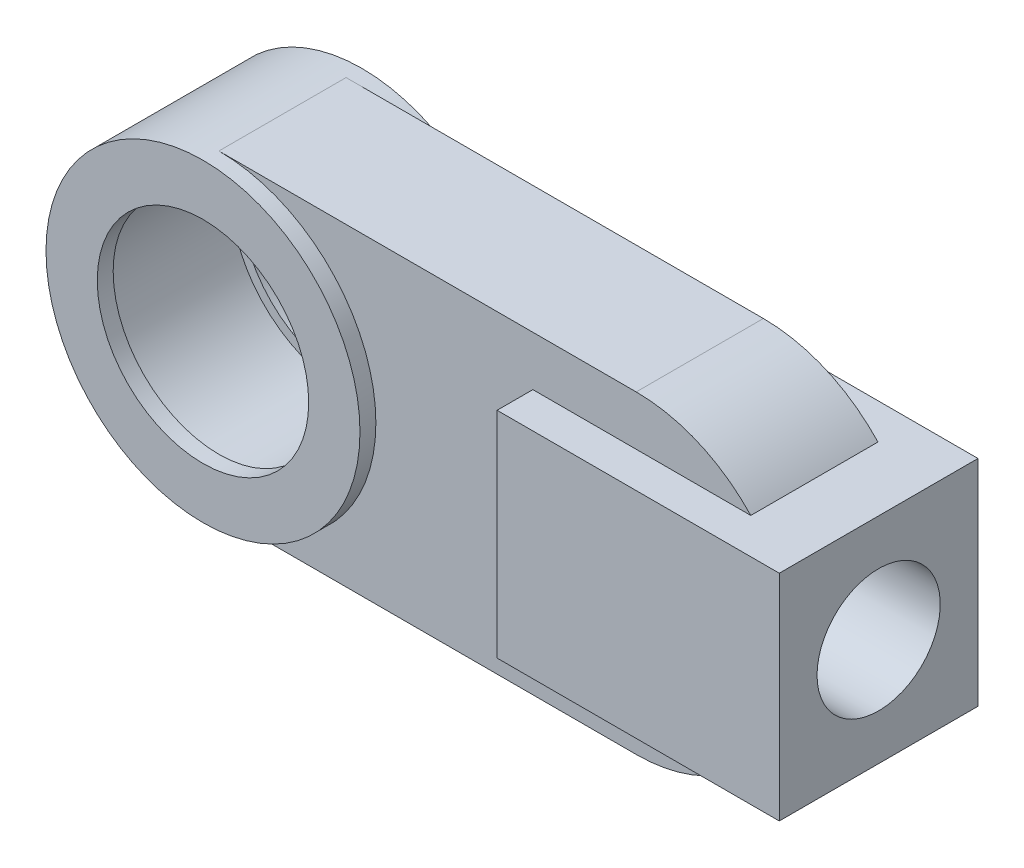
ISO-10303-21;
HEADER;
FILE_DESCRIPTION(('STEP AP214'),'2;1');
FILE_NAME('part.step','',(''),(''),'','','');
FILE_SCHEMA(('AUTOMOTIVE_DESIGN { 1 0 10303 214 1 1 1 1 }'));
ENDSEC;
DATA;
#1=APPLICATION_CONTEXT('core data for automotive mechanical design processes');
#2=APPLICATION_PROTOCOL_DEFINITION('international standard','automotive_design',2000,#1);
#3=PRODUCT_CONTEXT('',#1,'mechanical');
#4=PRODUCT('Part','Part','',(#3));
#5=PRODUCT_RELATED_PRODUCT_CATEGORY('part','',(#4));
#6=PRODUCT_DEFINITION_FORMATION('','',#4);
#7=PRODUCT_DEFINITION_CONTEXT('part definition',#1,'design');
#8=PRODUCT_DEFINITION('design','',#6,#7);
#9=PRODUCT_DEFINITION_SHAPE('','',#8);
#10=(LENGTH_UNIT() NAMED_UNIT(*) SI_UNIT(.MILLI.,.METRE.));
#11=(NAMED_UNIT(*) PLANE_ANGLE_UNIT() SI_UNIT($,.RADIAN.));
#12=(NAMED_UNIT(*) SI_UNIT($,.STERADIAN.) SOLID_ANGLE_UNIT());
#13=UNCERTAINTY_MEASURE_WITH_UNIT(LENGTH_MEASURE(1.E-05),#10,'distance_accuracy_value','');
#14=(GEOMETRIC_REPRESENTATION_CONTEXT(3) GLOBAL_UNCERTAINTY_ASSIGNED_CONTEXT((#13)) GLOBAL_UNIT_ASSIGNED_CONTEXT((#10,
#11,#12)) REPRESENTATION_CONTEXT('',''));
#15=CARTESIAN_POINT('',(0.,0.,0.));
#16=DIRECTION('',(0.,0.,1.));
#17=DIRECTION('',(1.,0.,0.));
#18=AXIS2_PLACEMENT_3D('',#15,#16,#17);
#19=CARTESIAN_POINT('',(10.5,0.,1.6));
#20=DIRECTION('',(0.,0.,-1.));
#21=DIRECTION('',(-1.,0.,0.));
#22=AXIS2_PLACEMENT_3D('',#19,#20,#21);
#23=CYLINDRICAL_SURFACE('',#22,3.95);
#24=DIRECTION('',(0.,0.,-1.));
#25=VECTOR('',#24,1.);
#26=CARTESIAN_POINT('',(13.3831406486677,-2.7,1.6));
#27=LINE('',#26,#25);
#28=CARTESIAN_POINT('',(13.3831406486677,-2.7,1.6));
#29=VERTEX_POINT('',#28);
#30=CARTESIAN_POINT('',(13.3831406486677,-2.7,-1.6));
#31=VERTEX_POINT('',#30);
#32=EDGE_CURVE('E171',#29,#31,#27,.T.);
#33=ORIENTED_EDGE('',*,*,#32,.F.);
#34=CARTESIAN_POINT('',(10.5,0.,1.6));
#35=DIRECTION('',(0.,0.,1.));
#36=DIRECTION('',(-1.,0.,0.));
#37=AXIS2_PLACEMENT_3D('',#34,#35,#36);
#38=CIRCLE('',#37,3.95);
#39=CARTESIAN_POINT('',(10.5,-3.95,1.6));
#40=VERTEX_POINT('',#39);
#41=EDGE_CURVE('E210',#40,#29,#38,.T.);
#42=ORIENTED_EDGE('',*,*,#41,.F.);
#43=DIRECTION('',(0.,0.,-1.));
#44=VECTOR('',#43,1.);
#45=CARTESIAN_POINT('',(10.5,-3.95,1.6));
#46=LINE('',#45,#44);
#47=CARTESIAN_POINT('',(10.5,-3.95,-1.6));
#48=VERTEX_POINT('',#47);
#49=EDGE_CURVE('E223',#40,#48,#46,.T.);
#50=ORIENTED_EDGE('',*,*,#49,.T.);
#51=CARTESIAN_POINT('',(10.5,0.,-1.6));
#52=DIRECTION('',(0.,0.,1.));
#53=DIRECTION('',(-1.,0.,0.));
#54=AXIS2_PLACEMENT_3D('',#51,#52,#53);
#55=CIRCLE('',#54,3.95);
#56=EDGE_CURVE('E216',#48,#31,#55,.T.);
#57=ORIENTED_EDGE('',*,*,#56,.T.);
#58=EDGE_LOOP('',(#33,#42,#50,#57));
#59=FACE_BOUND('',#58,.T.);
#60=ADVANCED_FACE('F39',(#59),#23,.T.);
#61=DIRECTION('',(0.,0.,-1.));
#62=VECTOR('',#61,1.);
#63=CARTESIAN_POINT('',(13.3831406486677,2.7,1.6));
#64=LINE('',#63,#62);
#65=CARTESIAN_POINT('',(13.3831406486677,2.7,-1.6));
#66=VERTEX_POINT('',#65);
#67=CARTESIAN_POINT('',(13.3831406486677,2.7,1.6));
#68=VERTEX_POINT('',#67);
#69=EDGE_CURVE('E163',#66,#68,#64,.F.);
#70=ORIENTED_EDGE('',*,*,#69,.F.);
#71=CARTESIAN_POINT('',(10.5,3.95,-1.6));
#72=VERTEX_POINT('',#71);
#73=EDGE_CURVE('E214',#66,#72,#55,.T.);
#74=ORIENTED_EDGE('',*,*,#73,.T.);
#75=DIRECTION('',(0.,0.,-1.));
#76=VECTOR('',#75,1.);
#77=CARTESIAN_POINT('',(10.5,3.95,1.6));
#78=LINE('',#77,#76);
#79=CARTESIAN_POINT('',(10.5,3.95,1.6));
#80=VERTEX_POINT('',#79);
#81=EDGE_CURVE('E225',#80,#72,#78,.T.);
#82=ORIENTED_EDGE('',*,*,#81,.F.);
#83=EDGE_CURVE('E62',#68,#80,#38,.T.);
#84=ORIENTED_EDGE('',*,*,#83,.F.);
#85=EDGE_LOOP('',(#70,#74,#82,#84));
#86=FACE_BOUND('',#85,.T.);
#87=ADVANCED_FACE('F286',(#86),#23,.T.);
#88=CARTESIAN_POINT('',(0.,0.,1.6));
#89=DIRECTION('',(0.,0.,-1.));
#90=DIRECTION('',(-1.,0.,0.));
#91=AXIS2_PLACEMENT_3D('',#88,#89,#90);
#92=PLANE('',#91);
#93=DIRECTION('',(1.,0.,0.));
#94=VECTOR('',#93,1.);
#95=CARTESIAN_POINT('',(0.,-2.7,1.6));
#96=LINE('',#95,#94);
#97=CARTESIAN_POINT('',(7.9,-2.7,1.6));
#98=VERTEX_POINT('',#97);
#99=EDGE_CURVE('E174',#98,#29,#96,.T.);
#100=ORIENTED_EDGE('',*,*,#99,.F.);
#101=DIRECTION('',(0.,-1.,0.));
#102=VECTOR('',#101,1.);
#103=CARTESIAN_POINT('',(7.9,0.,1.6));
#104=LINE('',#103,#102);
#105=CARTESIAN_POINT('',(7.9,2.7,1.6));
#106=VERTEX_POINT('',#105);
#107=EDGE_CURVE('E162',#106,#98,#104,.T.);
#108=ORIENTED_EDGE('',*,*,#107,.F.);
#109=DIRECTION('',(-1.,0.,0.));
#110=VECTOR('',#109,1.);
#111=CARTESIAN_POINT('',(0.,2.7,1.6));
#112=LINE('',#111,#110);
#113=EDGE_CURVE('E170',#68,#106,#112,.T.);
#114=ORIENTED_EDGE('',*,*,#113,.F.);
#115=ORIENTED_EDGE('',*,*,#83,.T.);
#116=DIRECTION('',(-1.,0.,0.));
#117=VECTOR('',#116,1.);
#118=CARTESIAN_POINT('',(0.,3.95,1.6));
#119=LINE('',#118,#117);
#120=CARTESIAN_POINT('',(0.,3.95,1.6));
#121=VERTEX_POINT('',#120);
#122=EDGE_CURVE('E209',#80,#121,#119,.T.);
#123=ORIENTED_EDGE('',*,*,#122,.T.);
#124=CARTESIAN_POINT('',(0.,0.,1.6));
#125=DIRECTION('',(0.,0.,1.));
#126=DIRECTION('',(1.,0.,0.));
#127=AXIS2_PLACEMENT_3D('',#124,#125,#126);
#128=CIRCLE('',#127,3.95);
#129=CARTESIAN_POINT('',(0.,-3.95,1.6));
#130=VERTEX_POINT('',#129);
#131=EDGE_CURVE('E87',#130,#121,#128,.T.);
#132=ORIENTED_EDGE('',*,*,#131,.F.);
#133=DIRECTION('',(1.,0.,0.));
#134=VECTOR('',#133,1.);
#135=CARTESIAN_POINT('',(10.5,-3.95,1.6));
#136=LINE('',#135,#134);
#137=EDGE_CURVE('E204',#130,#40,#136,.T.);
#138=ORIENTED_EDGE('',*,*,#137,.T.);
#139=ORIENTED_EDGE('',*,*,#41,.T.);
#140=EDGE_LOOP('',(#100,#108,#114,#115,#123,#132,#138,#139));
#141=FACE_BOUND('',#140,.T.);
#142=ADVANCED_FACE('F293',(#141),#92,.F.);
#143=CARTESIAN_POINT('',(0.,0.,-1.6));
#144=DIRECTION('',(0.,0.,-1.));
#145=DIRECTION('',(-1.,0.,0.));
#146=AXIS2_PLACEMENT_3D('',#143,#144,#145);
#147=PLANE('',#146);
#148=DIRECTION('',(0.,-1.,0.));
#149=VECTOR('',#148,1.);
#150=CARTESIAN_POINT('',(7.9,0.,-1.6));
#151=LINE('',#150,#149);
#152=CARTESIAN_POINT('',(7.9,2.7,-1.6));
#153=VERTEX_POINT('',#152);
#154=CARTESIAN_POINT('',(7.9,-2.7,-1.6));
#155=VERTEX_POINT('',#154);
#156=EDGE_CURVE('E48',#153,#155,#151,.T.);
#157=ORIENTED_EDGE('',*,*,#156,.T.);
#158=DIRECTION('',(1.,0.,0.));
#159=VECTOR('',#158,1.);
#160=CARTESIAN_POINT('',(0.,-2.7,-1.6));
#161=LINE('',#160,#159);
#162=EDGE_CURVE('E11',#155,#31,#161,.T.);
#163=ORIENTED_EDGE('',*,*,#162,.T.);
#164=ORIENTED_EDGE('',*,*,#56,.F.);
#165=DIRECTION('',(1.,0.,0.));
#166=VECTOR('',#165,1.);
#167=CARTESIAN_POINT('',(10.5,-3.95,-1.6));
#168=LINE('',#167,#166);
#169=CARTESIAN_POINT('',(0.,-3.95,-1.6));
#170=VERTEX_POINT('',#169);
#171=EDGE_CURVE('E213',#170,#48,#168,.T.);
#172=ORIENTED_EDGE('',*,*,#171,.F.);
#173=CARTESIAN_POINT('',(0.,0.,-1.6));
#174=DIRECTION('',(0.,0.,1.));
#175=DIRECTION('',(1.,0.,0.));
#176=AXIS2_PLACEMENT_3D('',#173,#174,#175);
#177=CIRCLE('',#176,3.95);
#178=CARTESIAN_POINT('',(0.,3.95,-1.6));
#179=VERTEX_POINT('',#178);
#180=EDGE_CURVE('E81',#170,#179,#177,.T.);
#181=ORIENTED_EDGE('',*,*,#180,.T.);
#182=DIRECTION('',(-1.,0.,0.));
#183=VECTOR('',#182,1.);
#184=CARTESIAN_POINT('',(0.,3.95,-1.6));
#185=LINE('',#184,#183);
#186=EDGE_CURVE('E206',#72,#179,#185,.T.);
#187=ORIENTED_EDGE('',*,*,#186,.F.);
#188=ORIENTED_EDGE('',*,*,#73,.F.);
#189=DIRECTION('',(-1.,0.,0.));
#190=VECTOR('',#189,1.);
#191=CARTESIAN_POINT('',(0.,2.7,-1.6));
#192=LINE('',#191,#190);
#193=EDGE_CURVE('E187',#66,#153,#192,.T.);
#194=ORIENTED_EDGE('',*,*,#193,.T.);
#195=EDGE_LOOP('',(#157,#163,#164,#172,#181,#187,#188,#194));
#196=FACE_BOUND('',#195,.T.);
#197=ADVANCED_FACE('F234',(#196),#147,.T.);
#198=CARTESIAN_POINT('',(0.,0.,1.6));
#199=DIRECTION('',(0.,0.,-1.));
#200=DIRECTION('',(-1.,0.,0.));
#201=AXIS2_PLACEMENT_3D('',#198,#199,#200);
#202=CYLINDRICAL_SURFACE('',#201,3.95);
#203=DIRECTION('',(0.,0.,-1.));
#204=VECTOR('',#203,1.);
#205=CARTESIAN_POINT('',(0.,3.95,1.6));
#206=LINE('',#205,#204);
#207=EDGE_CURVE('E215',#121,#179,#206,.T.);
#208=ORIENTED_EDGE('',*,*,#207,.T.);
#209=ORIENTED_EDGE('',*,*,#180,.F.);
#210=DIRECTION('',(0.,0.,-1.));
#211=VECTOR('',#210,1.);
#212=CARTESIAN_POINT('',(0.,-3.95,1.6));
#213=LINE('',#212,#211);
#214=EDGE_CURVE('E196',#130,#170,#213,.T.);
#215=ORIENTED_EDGE('',*,*,#214,.F.);
#216=ORIENTED_EDGE('',*,*,#131,.T.);
#217=EDGE_LOOP('',(#208,#209,#215,#216));
#218=FACE_BOUND('',#217,.T.);
#219=CARTESIAN_POINT('',(0.,0.,-2.));
#220=DIRECTION('',(0.,0.,1.));
#221=DIRECTION('',(1.,0.,0.));
#222=AXIS2_PLACEMENT_3D('',#219,#220,#221);
#223=CIRCLE('',#222,3.95);
#224=CARTESIAN_POINT('',(3.95,0.,-2.));
#225=VERTEX_POINT('',#224);
#226=EDGE_CURVE('E191',#225,#225,#223,.T.);
#227=ORIENTED_EDGE('',*,*,#226,.T.);
#228=EDGE_LOOP('',(#227));
#229=FACE_BOUND('',#228,.T.);
#230=CARTESIAN_POINT('',(0.,0.,2.));
#231=DIRECTION('',(0.,0.,1.));
#232=DIRECTION('',(1.,0.,0.));
#233=AXIS2_PLACEMENT_3D('',#230,#231,#232);
#234=CIRCLE('',#233,3.95);
#235=CARTESIAN_POINT('',(3.95,0.,2.));
#236=VERTEX_POINT('',#235);
#237=EDGE_CURVE('E185',#236,#236,#234,.T.);
#238=ORIENTED_EDGE('',*,*,#237,.F.);
#239=EDGE_LOOP('',(#238));
#240=FACE_BOUND('',#239,.T.);
#241=ADVANCED_FACE('F41',(#218,#229,#240),#202,.T.);
#242=CARTESIAN_POINT('',(10.5,-3.95,1.6));
#243=DIRECTION('',(0.,1.,0.));
#244=DIRECTION('',(0.,0.,1.));
#245=AXIS2_PLACEMENT_3D('',#242,#243,#244);
#246=PLANE('',#245);
#247=ORIENTED_EDGE('',*,*,#171,.T.);
#248=ORIENTED_EDGE('',*,*,#49,.F.);
#249=ORIENTED_EDGE('',*,*,#137,.F.);
#250=ORIENTED_EDGE('',*,*,#214,.T.);
#251=EDGE_LOOP('',(#247,#248,#249,#250));
#252=FACE_BOUND('',#251,.T.);
#253=ADVANCED_FACE('F303',(#252),#246,.F.);
#254=CARTESIAN_POINT('',(0.,3.95,1.6));
#255=DIRECTION('',(0.,-1.,0.));
#256=DIRECTION('',(0.,0.,-1.));
#257=AXIS2_PLACEMENT_3D('',#254,#255,#256);
#258=PLANE('',#257);
#259=ORIENTED_EDGE('',*,*,#186,.T.);
#260=ORIENTED_EDGE('',*,*,#207,.F.);
#261=ORIENTED_EDGE('',*,*,#122,.F.);
#262=ORIENTED_EDGE('',*,*,#81,.T.);
#263=EDGE_LOOP('',(#259,#260,#261,#262));
#264=FACE_BOUND('',#263,.T.);
#265=ADVANCED_FACE('F297',(#264),#258,.F.);
#266=CARTESIAN_POINT('',(0.,0.,2.));
#267=DIRECTION('',(0.,0.,-1.));
#268=DIRECTION('',(-1.,0.,0.));
#269=AXIS2_PLACEMENT_3D('',#266,#267,#268);
#270=CYLINDRICAL_SURFACE('',#269,2.9);
#271=CARTESIAN_POINT('',(0.,0.,-1.6));
#272=DIRECTION('',(0.,0.,-1.));
#273=DIRECTION('',(-1.,0.,0.));
#274=AXIS2_PLACEMENT_3D('',#271,#272,#273);
#275=CIRCLE('',#274,2.9);
#276=CARTESIAN_POINT('',(-2.9,0.,-1.6));
#277=VERTEX_POINT('',#276);
#278=EDGE_CURVE('E203',#277,#277,#275,.F.);
#279=ORIENTED_EDGE('',*,*,#278,.F.);
#280=EDGE_LOOP('',(#279));
#281=FACE_BOUND('',#280,.T.);
#282=CARTESIAN_POINT('',(0.,0.,1.6));
#283=DIRECTION('',(0.,0.,-1.));
#284=DIRECTION('',(-1.,0.,0.));
#285=AXIS2_PLACEMENT_3D('',#282,#283,#284);
#286=CIRCLE('',#285,2.9);
#287=CARTESIAN_POINT('',(-2.9,0.,1.6));
#288=VERTEX_POINT('',#287);
#289=EDGE_CURVE('E190',#288,#288,#286,.F.);
#290=ORIENTED_EDGE('',*,*,#289,.T.);
#291=EDGE_LOOP('',(#290));
#292=FACE_BOUND('',#291,.T.);
#293=ADVANCED_FACE('F310',(#281,#292),#270,.F.);
#294=CARTESIAN_POINT('',(0.,0.,-1.6));
#295=DIRECTION('',(0.,0.,1.));
#296=DIRECTION('',(1.,0.,0.));
#297=AXIS2_PLACEMENT_3D('',#294,#295,#296);
#298=PLANE('',#297);
#299=ORIENTED_EDGE('',*,*,#278,.T.);
#300=EDGE_LOOP('',(#299));
#301=FACE_BOUND('',#300,.T.);
#302=CARTESIAN_POINT('',(0.,0.,-1.6));
#303=DIRECTION('',(0.,0.,1.));
#304=DIRECTION('',(1.,0.,0.));
#305=AXIS2_PLACEMENT_3D('',#302,#303,#304);
#306=CIRCLE('',#305,2.66);
#307=CARTESIAN_POINT('',(2.66,0.,-1.6));
#308=VERTEX_POINT('',#307);
#309=EDGE_CURVE('E189',#308,#308,#306,.T.);
#310=ORIENTED_EDGE('',*,*,#309,.F.);
#311=EDGE_LOOP('',(#310));
#312=FACE_BOUND('',#311,.T.);
#313=ADVANCED_FACE('F452',(#301,#312),#298,.T.);
#314=CARTESIAN_POINT('',(0.,0.,-2.));
#315=DIRECTION('',(0.,0.,1.));
#316=DIRECTION('',(1.,0.,0.));
#317=AXIS2_PLACEMENT_3D('',#314,#315,#316);
#318=PLANE('',#317);
#319=ORIENTED_EDGE('',*,*,#226,.F.);
#320=EDGE_LOOP('',(#319));
#321=FACE_BOUND('',#320,.T.);
#322=CARTESIAN_POINT('',(0.,0.,-2.));
#323=DIRECTION('',(0.,0.,1.));
#324=DIRECTION('',(1.,0.,0.));
#325=AXIS2_PLACEMENT_3D('',#322,#323,#324);
#326=CIRCLE('',#325,2.66);
#327=CARTESIAN_POINT('',(2.66,0.,-2.));
#328=VERTEX_POINT('',#327);
#329=EDGE_CURVE('E192',#328,#328,#326,.T.);
#330=ORIENTED_EDGE('',*,*,#329,.T.);
#331=EDGE_LOOP('',(#330));
#332=FACE_BOUND('',#331,.T.);
#333=ADVANCED_FACE('F443',(#321,#332),#318,.F.);
#334=CARTESIAN_POINT('',(0.,0.,-1.6));
#335=DIRECTION('',(0.,0.,-1.));
#336=DIRECTION('',(-1.,0.,0.));
#337=AXIS2_PLACEMENT_3D('',#334,#335,#336);
#338=CYLINDRICAL_SURFACE('',#337,2.66);
#339=ORIENTED_EDGE('',*,*,#309,.T.);
#340=EDGE_LOOP('',(#339));
#341=FACE_BOUND('',#340,.T.);
#342=ORIENTED_EDGE('',*,*,#329,.F.);
#343=EDGE_LOOP('',(#342));
#344=FACE_BOUND('',#343,.T.);
#345=ADVANCED_FACE('F422',(#341,#344),#338,.F.);
#346=CARTESIAN_POINT('',(0.,0.,2.));
#347=DIRECTION('',(0.,0.,1.));
#348=DIRECTION('',(1.,0.,0.));
#349=AXIS2_PLACEMENT_3D('',#346,#347,#348);
#350=PLANE('',#349);
#351=ORIENTED_EDGE('',*,*,#237,.T.);
#352=EDGE_LOOP('',(#351));
#353=FACE_BOUND('',#352,.T.);
#354=CARTESIAN_POINT('',(0.,0.,2.));
#355=DIRECTION('',(0.,0.,1.));
#356=DIRECTION('',(1.,0.,0.));
#357=AXIS2_PLACEMENT_3D('',#354,#355,#356);
#358=CIRCLE('',#357,2.66);
#359=CARTESIAN_POINT('',(2.66,0.,2.));
#360=VERTEX_POINT('',#359);
#361=EDGE_CURVE('E177',#360,#360,#358,.T.);
#362=ORIENTED_EDGE('',*,*,#361,.F.);
#363=EDGE_LOOP('',(#362));
#364=FACE_BOUND('',#363,.T.);
#365=ADVANCED_FACE('F418',(#353,#364),#350,.T.);
#366=CARTESIAN_POINT('',(0.,0.,1.6));
#367=DIRECTION('',(0.,0.,1.));
#368=DIRECTION('',(1.,0.,0.));
#369=AXIS2_PLACEMENT_3D('',#366,#367,#368);
#370=PLANE('',#369);
#371=ORIENTED_EDGE('',*,*,#289,.F.);
#372=EDGE_LOOP('',(#371));
#373=FACE_BOUND('',#372,.T.);
#374=CARTESIAN_POINT('',(0.,0.,1.6));
#375=DIRECTION('',(0.,0.,1.));
#376=DIRECTION('',(1.,0.,0.));
#377=AXIS2_PLACEMENT_3D('',#374,#375,#376);
#378=CIRCLE('',#377,2.66);
#379=CARTESIAN_POINT('',(2.66,0.,1.6));
#380=VERTEX_POINT('',#379);
#381=EDGE_CURVE('E176',#380,#380,#378,.T.);
#382=ORIENTED_EDGE('',*,*,#381,.T.);
#383=EDGE_LOOP('',(#382));
#384=FACE_BOUND('',#383,.T.);
#385=ADVANCED_FACE('F408',(#373,#384),#370,.F.);
#386=CARTESIAN_POINT('',(0.,0.,2.));
#387=DIRECTION('',(0.,0.,-1.));
#388=DIRECTION('',(-1.,0.,0.));
#389=AXIS2_PLACEMENT_3D('',#386,#387,#388);
#390=CYLINDRICAL_SURFACE('',#389,2.66);
#391=ORIENTED_EDGE('',*,*,#361,.T.);
#392=EDGE_LOOP('',(#391));
#393=FACE_BOUND('',#392,.T.);
#394=ORIENTED_EDGE('',*,*,#381,.F.);
#395=EDGE_LOOP('',(#394));
#396=FACE_BOUND('',#395,.T.);
#397=ADVANCED_FACE('F380',(#393,#396),#390,.F.);
#398=CARTESIAN_POINT('',(7.9,2.7,2.5));
#399=DIRECTION('',(1.,0.,0.));
#400=DIRECTION('',(0.,0.,-1.));
#401=AXIS2_PLACEMENT_3D('',#398,#399,#400);
#402=PLANE('',#401);
#403=DIRECTION('',(0.,0.,-1.));
#404=VECTOR('',#403,1.);
#405=CARTESIAN_POINT('',(7.9,2.7,2.5));
#406=LINE('',#405,#404);
#407=CARTESIAN_POINT('',(7.9,2.7,2.5));
#408=VERTEX_POINT('',#407);
#409=EDGE_CURVE('E260',#408,#106,#406,.T.);
#410=ORIENTED_EDGE('',*,*,#409,.T.);
#411=ORIENTED_EDGE('',*,*,#107,.T.);
#412=DIRECTION('',(0.,0.,-1.));
#413=VECTOR('',#412,1.);
#414=CARTESIAN_POINT('',(7.9,-2.7,2.5));
#415=LINE('',#414,#413);
#416=CARTESIAN_POINT('',(7.9,-2.7,2.5));
#417=VERTEX_POINT('',#416);
#418=EDGE_CURVE('E141',#417,#98,#415,.T.);
#419=ORIENTED_EDGE('',*,*,#418,.F.);
#420=DIRECTION('',(0.,-1.,0.));
#421=VECTOR('',#420,1.);
#422=CARTESIAN_POINT('',(7.9,2.7,2.5));
#423=LINE('',#422,#421);
#424=EDGE_CURVE('E147',#408,#417,#423,.T.);
#425=ORIENTED_EDGE('',*,*,#424,.F.);
#426=EDGE_LOOP('',(#410,#411,#419,#425));
#427=FACE_BOUND('',#426,.T.);
#428=ADVANCED_FACE('F161',(#427),#402,.F.);
#429=CARTESIAN_POINT('',(7.9,-2.7,2.5));
#430=DIRECTION('',(0.,1.,0.));
#431=DIRECTION('',(0.,0.,1.));
#432=AXIS2_PLACEMENT_3D('',#429,#430,#431);
#433=PLANE('',#432);
#434=ORIENTED_EDGE('',*,*,#418,.T.);
#435=ORIENTED_EDGE('',*,*,#99,.T.);
#436=ORIENTED_EDGE('',*,*,#32,.T.);
#437=ORIENTED_EDGE('',*,*,#162,.F.);
#438=CARTESIAN_POINT('',(7.9,-2.7,-2.5));
#439=VERTEX_POINT('',#438);
#440=EDGE_CURVE('E164',#155,#439,#415,.T.);
#441=ORIENTED_EDGE('',*,*,#440,.T.);
#442=DIRECTION('',(1.,0.,0.));
#443=VECTOR('',#442,1.);
#444=CARTESIAN_POINT('',(7.9,-2.7,-2.5));
#445=LINE('',#444,#443);
#446=CARTESIAN_POINT('',(15.,-2.7,-2.5));
#447=VERTEX_POINT('',#446);
#448=EDGE_CURVE('E244',#439,#447,#445,.T.);
#449=ORIENTED_EDGE('',*,*,#448,.T.);
#450=DIRECTION('',(0.,0.,-1.));
#451=VECTOR('',#450,1.);
#452=CARTESIAN_POINT('',(15.,-2.7,2.5));
#453=LINE('',#452,#451);
#454=CARTESIAN_POINT('',(15.,-2.7,2.5));
#455=VERTEX_POINT('',#454);
#456=EDGE_CURVE('E148',#455,#447,#453,.T.);
#457=ORIENTED_EDGE('',*,*,#456,.F.);
#458=DIRECTION('',(1.,0.,0.));
#459=VECTOR('',#458,1.);
#460=CARTESIAN_POINT('',(7.9,-2.7,2.5));
#461=LINE('',#460,#459);
#462=EDGE_CURVE('E137',#417,#455,#461,.T.);
#463=ORIENTED_EDGE('',*,*,#462,.F.);
#464=EDGE_LOOP('',(#434,#435,#436,#437,#441,#449,#457,#463));
#465=FACE_BOUND('',#464,.T.);
#466=ADVANCED_FACE('F143',(#465),#433,.F.);
#467=CARTESIAN_POINT('',(15.,2.7,2.5));
#468=DIRECTION('',(0.,-1.,0.));
#469=DIRECTION('',(0.,0.,-1.));
#470=AXIS2_PLACEMENT_3D('',#467,#468,#469);
#471=PLANE('',#470);
#472=ORIENTED_EDGE('',*,*,#69,.T.);
#473=ORIENTED_EDGE('',*,*,#113,.T.);
#474=ORIENTED_EDGE('',*,*,#409,.F.);
#475=DIRECTION('',(-1.,0.,0.));
#476=VECTOR('',#475,1.);
#477=CARTESIAN_POINT('',(15.,2.7,2.5));
#478=LINE('',#477,#476);
#479=CARTESIAN_POINT('',(15.,2.7,2.5));
#480=VERTEX_POINT('',#479);
#481=EDGE_CURVE('E154',#480,#408,#478,.T.);
#482=ORIENTED_EDGE('',*,*,#481,.F.);
#483=DIRECTION('',(0.,0.,-1.));
#484=VECTOR('',#483,1.);
#485=CARTESIAN_POINT('',(15.,2.7,2.5));
#486=LINE('',#485,#484);
#487=CARTESIAN_POINT('',(15.,2.7,-2.5));
#488=VERTEX_POINT('',#487);
#489=EDGE_CURVE('E256',#480,#488,#486,.T.);
#490=ORIENTED_EDGE('',*,*,#489,.T.);
#491=DIRECTION('',(-1.,0.,0.));
#492=VECTOR('',#491,1.);
#493=CARTESIAN_POINT('',(15.,2.7,-2.5));
#494=LINE('',#493,#492);
#495=CARTESIAN_POINT('',(7.9,2.7,-2.5));
#496=VERTEX_POINT('',#495);
#497=EDGE_CURVE('E157',#488,#496,#494,.T.);
#498=ORIENTED_EDGE('',*,*,#497,.T.);
#499=EDGE_CURVE('E54',#153,#496,#406,.T.);
#500=ORIENTED_EDGE('',*,*,#499,.F.);
#501=ORIENTED_EDGE('',*,*,#193,.F.);
#502=EDGE_LOOP('',(#472,#473,#474,#482,#490,#498,#500,#501));
#503=FACE_BOUND('',#502,.T.);
#504=ADVANCED_FACE('F281',(#503),#471,.F.);
#505=ORIENTED_EDGE('',*,*,#156,.F.);
#506=ORIENTED_EDGE('',*,*,#499,.T.);
#507=DIRECTION('',(0.,-1.,0.));
#508=VECTOR('',#507,1.);
#509=CARTESIAN_POINT('',(7.9,2.7,-2.5));
#510=LINE('',#509,#508);
#511=EDGE_CURVE('E241',#496,#439,#510,.T.);
#512=ORIENTED_EDGE('',*,*,#511,.T.);
#513=ORIENTED_EDGE('',*,*,#440,.F.);
#514=EDGE_LOOP('',(#505,#506,#512,#513));
#515=FACE_BOUND('',#514,.T.);
#516=ADVANCED_FACE('F238',(#515),#402,.F.);
#517=CARTESIAN_POINT('',(15.,-2.7,2.5));
#518=DIRECTION('',(-1.,0.,0.));
#519=DIRECTION('',(0.,0.,1.));
#520=AXIS2_PLACEMENT_3D('',#517,#518,#519);
#521=PLANE('',#520);
#522=CARTESIAN_POINT('',(15.,0.,0.));
#523=DIRECTION('',(-1.,0.,0.));
#524=DIRECTION('',(0.,0.,1.));
#525=AXIS2_PLACEMENT_3D('',#522,#523,#524);
#526=CIRCLE('',#525,1.55);
#527=CARTESIAN_POINT('',(15.,0.,1.55));
#528=VERTEX_POINT('',#527);
#529=EDGE_CURVE('E43',#528,#528,#526,.F.);
#530=ORIENTED_EDGE('',*,*,#529,.F.);
#531=EDGE_LOOP('',(#530));
#532=FACE_BOUND('',#531,.T.);
#533=DIRECTION('',(0.,1.,0.));
#534=VECTOR('',#533,1.);
#535=CARTESIAN_POINT('',(15.,-2.7,-2.5));
#536=LINE('',#535,#534);
#537=EDGE_CURVE('E249',#447,#488,#536,.T.);
#538=ORIENTED_EDGE('',*,*,#537,.T.);
#539=ORIENTED_EDGE('',*,*,#489,.F.);
#540=DIRECTION('',(0.,1.,0.));
#541=VECTOR('',#540,1.);
#542=CARTESIAN_POINT('',(15.,-2.7,2.5));
#543=LINE('',#542,#541);
#544=EDGE_CURVE('E149',#455,#480,#543,.T.);
#545=ORIENTED_EDGE('',*,*,#544,.F.);
#546=ORIENTED_EDGE('',*,*,#456,.T.);
#547=EDGE_LOOP('',(#538,#539,#545,#546));
#548=FACE_BOUND('',#547,.T.);
#549=ADVANCED_FACE('F265',(#532,#548),#521,.F.);
#550=CARTESIAN_POINT('',(0.,0.,2.5));
#551=DIRECTION('',(0.,0.,1.));
#552=DIRECTION('',(1.,0.,0.));
#553=AXIS2_PLACEMENT_3D('',#550,#551,#552);
#554=PLANE('',#553);
#555=ORIENTED_EDGE('',*,*,#424,.T.);
#556=ORIENTED_EDGE('',*,*,#462,.T.);
#557=ORIENTED_EDGE('',*,*,#544,.T.);
#558=ORIENTED_EDGE('',*,*,#481,.T.);
#559=EDGE_LOOP('',(#555,#556,#557,#558));
#560=FACE_BOUND('',#559,.T.);
#561=ADVANCED_FACE('F153',(#560),#554,.T.);
#562=CARTESIAN_POINT('',(0.,0.,-2.5));
#563=DIRECTION('',(0.,0.,1.));
#564=DIRECTION('',(1.,0.,0.));
#565=AXIS2_PLACEMENT_3D('',#562,#563,#564);
#566=PLANE('',#565);
#567=ORIENTED_EDGE('',*,*,#511,.F.);
#568=ORIENTED_EDGE('',*,*,#497,.F.);
#569=ORIENTED_EDGE('',*,*,#537,.F.);
#570=ORIENTED_EDGE('',*,*,#448,.F.);
#571=EDGE_LOOP('',(#567,#568,#569,#570));
#572=FACE_BOUND('',#571,.T.);
#573=ADVANCED_FACE('F246',(#572),#566,.F.);
#574=CARTESIAN_POINT('',(16.,0.,0.));
#575=DIRECTION('',(-1.,0.,0.));
#576=DIRECTION('',(0.,0.,1.));
#577=AXIS2_PLACEMENT_3D('',#574,#575,#576);
#578=CYLINDRICAL_SURFACE('',#577,1.55);
#579=CARTESIAN_POINT('',(7.,0.,0.));
#580=DIRECTION('',(1.,0.,0.));
#581=DIRECTION('',(0.,0.,-1.));
#582=AXIS2_PLACEMENT_3D('',#579,#580,#581);
#583=CIRCLE('',#582,1.55);
#584=CARTESIAN_POINT('',(7.,0.,-1.55));
#585=VERTEX_POINT('',#584);
#586=EDGE_CURVE('E264',#585,#585,#583,.T.);
#587=ORIENTED_EDGE('',*,*,#586,.F.);
#588=EDGE_LOOP('',(#587));
#589=FACE_BOUND('',#588,.T.);
#590=ORIENTED_EDGE('',*,*,#529,.T.);
#591=EDGE_LOOP('',(#590));
#592=FACE_BOUND('',#591,.T.);
#593=ADVANCED_FACE('F275',(#589,#592),#578,.F.);
#594=CARTESIAN_POINT('',(7.,0.,0.));
#595=DIRECTION('',(1.,0.,0.));
#596=DIRECTION('',(0.,0.,-1.));
#597=AXIS2_PLACEMENT_3D('',#594,#595,#596);
#598=PLANE('',#597);
#599=ORIENTED_EDGE('',*,*,#586,.T.);
#600=EDGE_LOOP('',(#599));
#601=FACE_BOUND('',#600,.T.);
#602=ADVANCED_FACE('F324',(#601),#598,.T.);
#603=CLOSED_SHELL('',(#60,#87,#142,#197,#241,#253,#265,#293,#313,#333,#345,#365,#385,#397,#428,
#466,#504,#516,#549,#561,#573,#593,#602));
#604=MANIFOLD_SOLID_BREP('B2',#603);
#605=ADVANCED_BREP_SHAPE_REPRESENTATION('',(#18,#604),#14);
#606=SHAPE_DEFINITION_REPRESENTATION(#9,#605);
ENDSEC;
END-ISO-10303-21;
